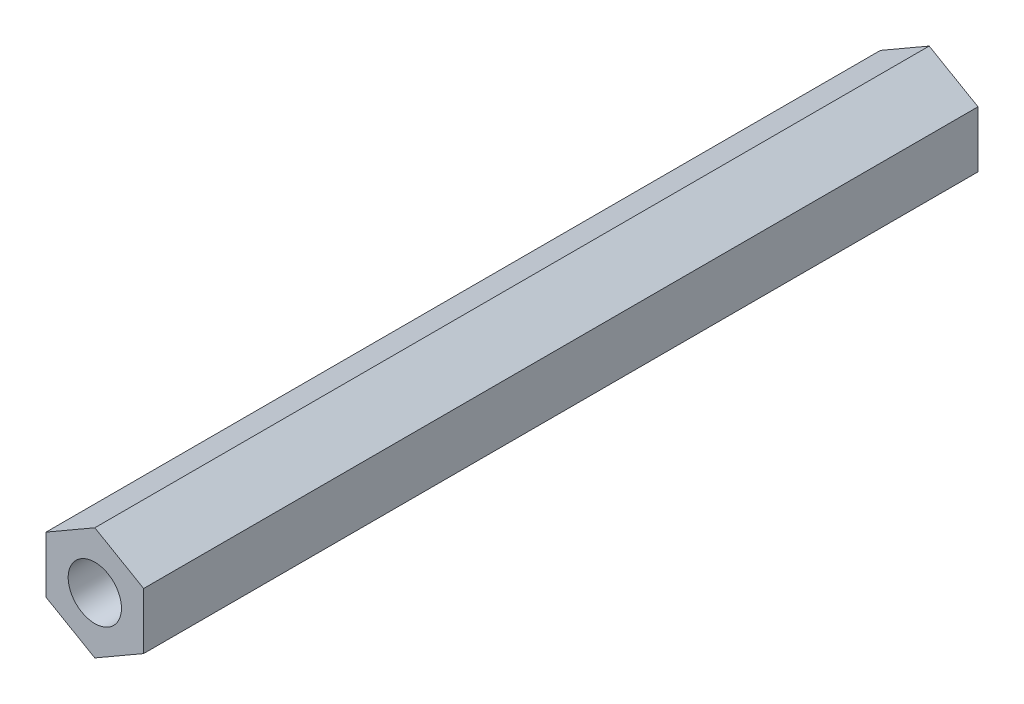
ISO-10303-21;
HEADER;
FILE_DESCRIPTION(('STEP AP214'),'2;1');
FILE_NAME('part.step','',(''),(''),'','','');
FILE_SCHEMA(('AUTOMOTIVE_DESIGN { 1 0 10303 214 1 1 1 1 }'));
ENDSEC;
DATA;
#1=APPLICATION_CONTEXT('core data for automotive mechanical design processes');
#2=APPLICATION_PROTOCOL_DEFINITION('international standard','automotive_design',2000,#1);
#3=PRODUCT_CONTEXT('',#1,'mechanical');
#4=PRODUCT('Part','Part','',(#3));
#5=PRODUCT_RELATED_PRODUCT_CATEGORY('part','',(#4));
#6=PRODUCT_DEFINITION_FORMATION('','',#4);
#7=PRODUCT_DEFINITION_CONTEXT('part definition',#1,'design');
#8=PRODUCT_DEFINITION('design','',#6,#7);
#9=PRODUCT_DEFINITION_SHAPE('','',#8);
#10=(LENGTH_UNIT() NAMED_UNIT(*) SI_UNIT(.MILLI.,.METRE.));
#11=(NAMED_UNIT(*) PLANE_ANGLE_UNIT() SI_UNIT($,.RADIAN.));
#12=(NAMED_UNIT(*) SI_UNIT($,.STERADIAN.) SOLID_ANGLE_UNIT());
#13=UNCERTAINTY_MEASURE_WITH_UNIT(LENGTH_MEASURE(1.E-05),#10,'distance_accuracy_value','');
#14=(GEOMETRIC_REPRESENTATION_CONTEXT(3) GLOBAL_UNCERTAINTY_ASSIGNED_CONTEXT((#13)) GLOBAL_UNIT_ASSIGNED_CONTEXT((#10,
#11,#12)) REPRESENTATION_CONTEXT('',''));
#15=CARTESIAN_POINT('',(0.,0.,0.));
#16=DIRECTION('',(0.,0.,1.));
#17=DIRECTION('',(1.,0.,0.));
#18=AXIS2_PLACEMENT_3D('',#15,#16,#17);
#19=CARTESIAN_POINT('',(0.,0.,47.));
#20=DIRECTION('',(0.,0.,1.));
#21=DIRECTION('',(1.,0.,0.));
#22=AXIS2_PLACEMENT_3D('',#19,#20,#21);
#23=PLANE('',#22);
#24=DIRECTION('',(0.866025403784439,-0.5,0.));
#25=VECTOR('',#24,1.);
#26=CARTESIAN_POINT('',(-2.75,-1.58771324027147,47.));
#27=LINE('',#26,#25);
#28=CARTESIAN_POINT('',(-2.75,-1.58771324027147,47.));
#29=VERTEX_POINT('',#28);
#30=CARTESIAN_POINT('',(0.,-3.17542648054294,47.));
#31=VERTEX_POINT('',#30);
#32=EDGE_CURVE('E131',#29,#31,#27,.T.);
#33=ORIENTED_EDGE('',*,*,#32,.T.);
#34=DIRECTION('',(0.866025403784438,0.5,0.));
#35=VECTOR('',#34,1.);
#36=CARTESIAN_POINT('',(0.,-3.17542648054294,47.));
#37=LINE('',#36,#35);
#38=CARTESIAN_POINT('',(2.75,-1.58771324027147,47.));
#39=VERTEX_POINT('',#38);
#40=EDGE_CURVE('E89',#31,#39,#37,.T.);
#41=ORIENTED_EDGE('',*,*,#40,.T.);
#42=DIRECTION('',(0.,1.,0.));
#43=VECTOR('',#42,1.);
#44=CARTESIAN_POINT('',(2.75,-1.58771324027147,47.));
#45=LINE('',#44,#43);
#46=CARTESIAN_POINT('',(2.75,1.58771324027147,47.));
#47=VERTEX_POINT('',#46);
#48=EDGE_CURVE('E102',#39,#47,#45,.T.);
#49=ORIENTED_EDGE('',*,*,#48,.T.);
#50=DIRECTION('',(-0.866025403784438,0.5,0.));
#51=VECTOR('',#50,1.);
#52=CARTESIAN_POINT('',(2.75,1.58771324027147,47.));
#53=LINE('',#52,#51);
#54=CARTESIAN_POINT('',(0.,3.17542648054294,47.));
#55=VERTEX_POINT('',#54);
#56=EDGE_CURVE('E96',#47,#55,#53,.T.);
#57=ORIENTED_EDGE('',*,*,#56,.T.);
#58=DIRECTION('',(-0.866025403784438,-0.5,0.));
#59=VECTOR('',#58,1.);
#60=CARTESIAN_POINT('',(0.,3.17542648054294,47.));
#61=LINE('',#60,#59);
#62=CARTESIAN_POINT('',(-2.75,1.58771324027147,47.));
#63=VERTEX_POINT('',#62);
#64=EDGE_CURVE('E100',#55,#63,#61,.T.);
#65=ORIENTED_EDGE('',*,*,#64,.T.);
#66=DIRECTION('',(0.,-1.,0.));
#67=VECTOR('',#66,1.);
#68=CARTESIAN_POINT('',(-2.75,1.58771324027147,47.));
#69=LINE('',#68,#67);
#70=EDGE_CURVE('E52',#63,#29,#69,.T.);
#71=ORIENTED_EDGE('',*,*,#70,.T.);
#72=EDGE_LOOP('',(#33,#41,#49,#57,#65,#71));
#73=FACE_BOUND('',#72,.T.);
#74=CARTESIAN_POINT('',(0.,0.,47.));
#75=DIRECTION('',(0.,0.,1.));
#76=DIRECTION('',(1.,0.,0.));
#77=AXIS2_PLACEMENT_3D('',#74,#75,#76);
#78=CIRCLE('',#77,1.5);
#79=CARTESIAN_POINT('',(1.5,0.,47.));
#80=VERTEX_POINT('',#79);
#81=EDGE_CURVE('E124',#80,#80,#78,.T.);
#82=ORIENTED_EDGE('',*,*,#81,.F.);
#83=EDGE_LOOP('',(#82));
#84=FACE_BOUND('',#83,.T.);
#85=ADVANCED_FACE('F35',(#73,#84),#23,.T.);
#86=CARTESIAN_POINT('',(0.,0.,0.));
#87=DIRECTION('',(0.,0.,1.));
#88=DIRECTION('',(1.,0.,0.));
#89=AXIS2_PLACEMENT_3D('',#86,#87,#88);
#90=PLANE('',#89);
#91=DIRECTION('',(0.866025403784439,-0.5,0.));
#92=VECTOR('',#91,1.);
#93=CARTESIAN_POINT('',(-2.75,-1.58771324027147,0.));
#94=LINE('',#93,#92);
#95=CARTESIAN_POINT('',(-2.75,-1.58771324027147,0.));
#96=VERTEX_POINT('',#95);
#97=CARTESIAN_POINT('',(0.,-3.17542648054294,0.));
#98=VERTEX_POINT('',#97);
#99=EDGE_CURVE('E120',#96,#98,#94,.T.);
#100=ORIENTED_EDGE('',*,*,#99,.F.);
#101=DIRECTION('',(0.,-1.,0.));
#102=VECTOR('',#101,1.);
#103=CARTESIAN_POINT('',(-2.75,1.58771324027147,0.));
#104=LINE('',#103,#102);
#105=CARTESIAN_POINT('',(-2.75,1.58771324027147,0.));
#106=VERTEX_POINT('',#105);
#107=EDGE_CURVE('E81',#106,#96,#104,.T.);
#108=ORIENTED_EDGE('',*,*,#107,.F.);
#109=DIRECTION('',(-0.866025403784438,-0.5,0.));
#110=VECTOR('',#109,1.);
#111=CARTESIAN_POINT('',(0.,3.17542648054294,0.));
#112=LINE('',#111,#110);
#113=CARTESIAN_POINT('',(0.,3.17542648054294,0.));
#114=VERTEX_POINT('',#113);
#115=EDGE_CURVE('E75',#114,#106,#112,.T.);
#116=ORIENTED_EDGE('',*,*,#115,.F.);
#117=DIRECTION('',(-0.866025403784438,0.5,0.));
#118=VECTOR('',#117,1.);
#119=CARTESIAN_POINT('',(2.75,1.58771324027147,0.));
#120=LINE('',#119,#118);
#121=CARTESIAN_POINT('',(2.75,1.58771324027147,0.));
#122=VERTEX_POINT('',#121);
#123=EDGE_CURVE('E110',#122,#114,#120,.T.);
#124=ORIENTED_EDGE('',*,*,#123,.F.);
#125=DIRECTION('',(0.,1.,0.));
#126=VECTOR('',#125,1.);
#127=CARTESIAN_POINT('',(2.75,-1.58771324027147,0.));
#128=LINE('',#127,#126);
#129=CARTESIAN_POINT('',(2.75,-1.58771324027147,0.));
#130=VERTEX_POINT('',#129);
#131=EDGE_CURVE('E126',#130,#122,#128,.T.);
#132=ORIENTED_EDGE('',*,*,#131,.F.);
#133=DIRECTION('',(0.866025403784438,0.5,0.));
#134=VECTOR('',#133,1.);
#135=CARTESIAN_POINT('',(0.,-3.17542648054294,0.));
#136=LINE('',#135,#134);
#137=EDGE_CURVE('E123',#98,#130,#136,.T.);
#138=ORIENTED_EDGE('',*,*,#137,.F.);
#139=EDGE_LOOP('',(#100,#108,#116,#124,#132,#138));
#140=FACE_BOUND('',#139,.T.);
#141=CARTESIAN_POINT('',(0.,0.,0.));
#142=DIRECTION('',(0.,0.,1.));
#143=DIRECTION('',(1.,0.,0.));
#144=AXIS2_PLACEMENT_3D('',#141,#142,#143);
#145=CIRCLE('',#144,1.5);
#146=CARTESIAN_POINT('',(1.5,0.,0.));
#147=VERTEX_POINT('',#146);
#148=EDGE_CURVE('E224',#147,#147,#145,.T.);
#149=ORIENTED_EDGE('',*,*,#148,.T.);
#150=EDGE_LOOP('',(#149));
#151=FACE_BOUND('',#150,.T.);
#152=ADVANCED_FACE('F140',(#140,#151),#90,.F.);
#153=CARTESIAN_POINT('',(-2.75,-1.58771324027147,47.));
#154=DIRECTION('',(0.5,0.866025403784439,0.));
#155=DIRECTION('',(-0.866025403784439,0.5,0.));
#156=AXIS2_PLACEMENT_3D('',#153,#154,#155);
#157=PLANE('',#156);
#158=ORIENTED_EDGE('',*,*,#99,.T.);
#159=DIRECTION('',(0.,0.,-1.));
#160=VECTOR('',#159,1.);
#161=CARTESIAN_POINT('',(0.,-3.17542648054294,47.));
#162=LINE('',#161,#160);
#163=EDGE_CURVE('E11',#31,#98,#162,.T.);
#164=ORIENTED_EDGE('',*,*,#163,.F.);
#165=ORIENTED_EDGE('',*,*,#32,.F.);
#166=DIRECTION('',(0.,0.,-1.));
#167=VECTOR('',#166,1.);
#168=CARTESIAN_POINT('',(-2.75,-1.58771324027147,47.));
#169=LINE('',#168,#167);
#170=EDGE_CURVE('E116',#29,#96,#169,.T.);
#171=ORIENTED_EDGE('',*,*,#170,.T.);
#172=EDGE_LOOP('',(#158,#164,#165,#171));
#173=FACE_BOUND('',#172,.T.);
#174=ADVANCED_FACE('F37',(#173),#157,.F.);
#175=CARTESIAN_POINT('',(0.,-3.17542648054294,47.));
#176=DIRECTION('',(-0.5,0.866025403784438,0.));
#177=DIRECTION('',(-0.866025403784439,-0.5,0.));
#178=AXIS2_PLACEMENT_3D('',#175,#176,#177);
#179=PLANE('',#178);
#180=ORIENTED_EDGE('',*,*,#137,.T.);
#181=DIRECTION('',(0.,0.,-1.));
#182=VECTOR('',#181,1.);
#183=CARTESIAN_POINT('',(2.75,-1.58771324027147,47.));
#184=LINE('',#183,#182);
#185=EDGE_CURVE('E44',#39,#130,#184,.T.);
#186=ORIENTED_EDGE('',*,*,#185,.F.);
#187=ORIENTED_EDGE('',*,*,#40,.F.);
#188=ORIENTED_EDGE('',*,*,#163,.T.);
#189=EDGE_LOOP('',(#180,#186,#187,#188));
#190=FACE_BOUND('',#189,.T.);
#191=ADVANCED_FACE('F165',(#190),#179,.F.);
#192=CARTESIAN_POINT('',(2.75,-1.58771324027147,47.));
#193=DIRECTION('',(-1.,0.,0.));
#194=DIRECTION('',(0.,0.,1.));
#195=AXIS2_PLACEMENT_3D('',#192,#193,#194);
#196=PLANE('',#195);
#197=ORIENTED_EDGE('',*,*,#131,.T.);
#198=DIRECTION('',(0.,0.,-1.));
#199=VECTOR('',#198,1.);
#200=CARTESIAN_POINT('',(2.75,1.58771324027147,47.));
#201=LINE('',#200,#199);
#202=EDGE_CURVE('E111',#47,#122,#201,.T.);
#203=ORIENTED_EDGE('',*,*,#202,.F.);
#204=ORIENTED_EDGE('',*,*,#48,.F.);
#205=ORIENTED_EDGE('',*,*,#185,.T.);
#206=EDGE_LOOP('',(#197,#203,#204,#205));
#207=FACE_BOUND('',#206,.T.);
#208=ADVANCED_FACE('F137',(#207),#196,.F.);
#209=CARTESIAN_POINT('',(2.75,1.58771324027147,47.));
#210=DIRECTION('',(-0.5,-0.866025403784439,0.));
#211=DIRECTION('',(0.866025403784439,-0.5,0.));
#212=AXIS2_PLACEMENT_3D('',#209,#210,#211);
#213=PLANE('',#212);
#214=ORIENTED_EDGE('',*,*,#123,.T.);
#215=DIRECTION('',(0.,0.,-1.));
#216=VECTOR('',#215,1.);
#217=CARTESIAN_POINT('',(0.,3.17542648054294,47.));
#218=LINE('',#217,#216);
#219=EDGE_CURVE('E107',#55,#114,#218,.T.);
#220=ORIENTED_EDGE('',*,*,#219,.F.);
#221=ORIENTED_EDGE('',*,*,#56,.F.);
#222=ORIENTED_EDGE('',*,*,#202,.T.);
#223=EDGE_LOOP('',(#214,#220,#221,#222));
#224=FACE_BOUND('',#223,.T.);
#225=ADVANCED_FACE('F108',(#224),#213,.F.);
#226=CARTESIAN_POINT('',(0.,3.17542648054294,47.));
#227=DIRECTION('',(0.5,-0.866025403784438,0.));
#228=DIRECTION('',(0.866025403784439,0.5,0.));
#229=AXIS2_PLACEMENT_3D('',#226,#227,#228);
#230=PLANE('',#229);
#231=ORIENTED_EDGE('',*,*,#115,.T.);
#232=DIRECTION('',(0.,0.,-1.));
#233=VECTOR('',#232,1.);
#234=CARTESIAN_POINT('',(-2.75,1.58771324027147,47.));
#235=LINE('',#234,#233);
#236=EDGE_CURVE('E112',#63,#106,#235,.T.);
#237=ORIENTED_EDGE('',*,*,#236,.F.);
#238=ORIENTED_EDGE('',*,*,#64,.F.);
#239=ORIENTED_EDGE('',*,*,#219,.T.);
#240=EDGE_LOOP('',(#231,#237,#238,#239));
#241=FACE_BOUND('',#240,.T.);
#242=ADVANCED_FACE('F114',(#241),#230,.F.);
#243=CARTESIAN_POINT('',(-2.75,1.58771324027147,47.));
#244=DIRECTION('',(1.,0.,0.));
#245=DIRECTION('',(0.,0.,-1.));
#246=AXIS2_PLACEMENT_3D('',#243,#244,#245);
#247=PLANE('',#246);
#248=ORIENTED_EDGE('',*,*,#107,.T.);
#249=ORIENTED_EDGE('',*,*,#170,.F.);
#250=ORIENTED_EDGE('',*,*,#70,.F.);
#251=ORIENTED_EDGE('',*,*,#236,.T.);
#252=EDGE_LOOP('',(#248,#249,#250,#251));
#253=FACE_BOUND('',#252,.T.);
#254=ADVANCED_FACE('F145',(#253),#247,.F.);
#255=CARTESIAN_POINT('',(0.,0.,47.));
#256=DIRECTION('',(0.,0.,-1.));
#257=DIRECTION('',(-1.,0.,0.));
#258=AXIS2_PLACEMENT_3D('',#255,#256,#257);
#259=CYLINDRICAL_SURFACE('',#258,1.5);
#260=ORIENTED_EDGE('',*,*,#81,.T.);
#261=EDGE_LOOP('',(#260));
#262=FACE_BOUND('',#261,.T.);
#263=ORIENTED_EDGE('',*,*,#148,.F.);
#264=EDGE_LOOP('',(#263));
#265=FACE_BOUND('',#264,.T.);
#266=ADVANCED_FACE('F147',(#262,#265),#259,.F.);
#267=CLOSED_SHELL('',(#85,#152,#174,#191,#208,#225,#242,#254,#266));
#268=MANIFOLD_SOLID_BREP('B2',#267);
#269=ADVANCED_BREP_SHAPE_REPRESENTATION('',(#18,#268),#14);
#270=SHAPE_DEFINITION_REPRESENTATION(#9,#269);
ENDSEC;
END-ISO-10303-21;
